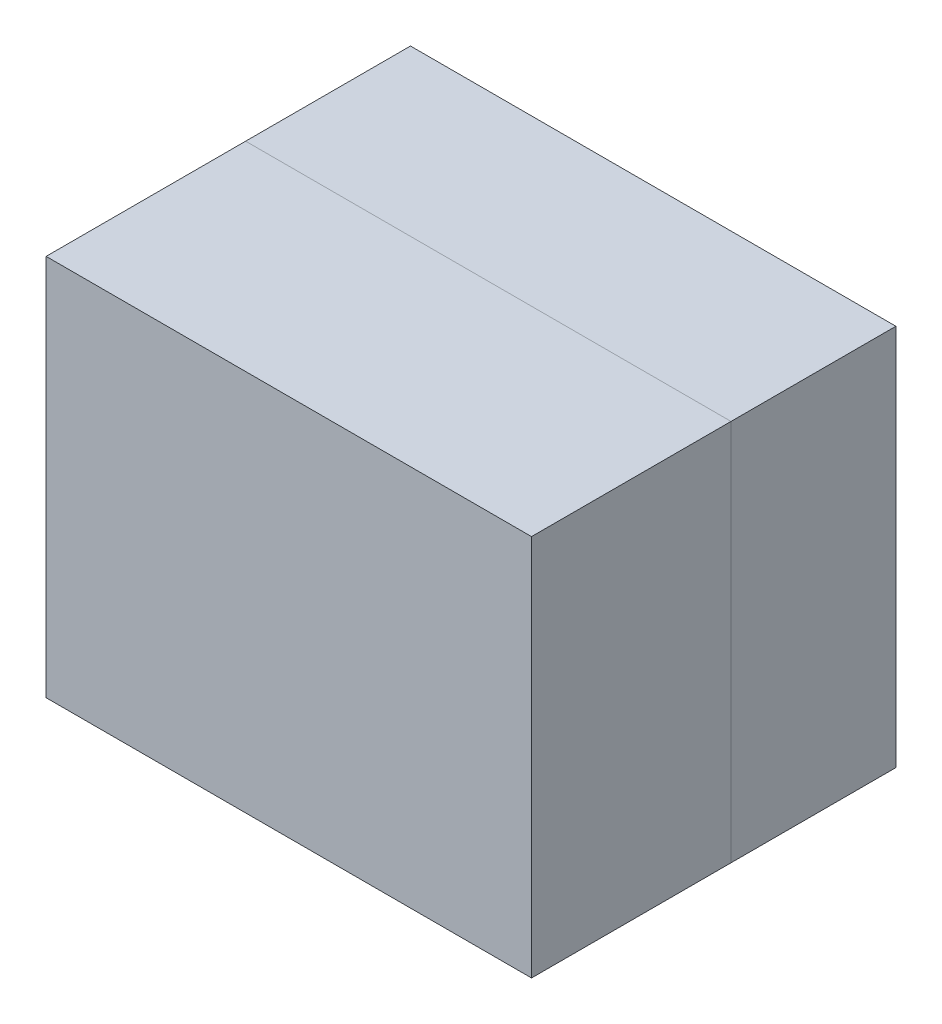
ISO-10303-21;
HEADER;
FILE_DESCRIPTION(('STEP AP214'),'2;1');
FILE_NAME('part.step','',(''),(''),'','','');
FILE_SCHEMA(('AUTOMOTIVE_DESIGN { 1 0 10303 214 1 1 1 1 }'));
ENDSEC;
DATA;
#1=APPLICATION_CONTEXT('core data for automotive mechanical design processes');
#2=APPLICATION_PROTOCOL_DEFINITION('international standard','automotive_design',2000,#1);
#3=PRODUCT_CONTEXT('',#1,'mechanical');
#4=PRODUCT('Part','Part','',(#3));
#5=PRODUCT_RELATED_PRODUCT_CATEGORY('part','',(#4));
#6=PRODUCT_DEFINITION_FORMATION('','',#4);
#7=PRODUCT_DEFINITION_CONTEXT('part definition',#1,'design');
#8=PRODUCT_DEFINITION('design','',#6,#7);
#9=PRODUCT_DEFINITION_SHAPE('','',#8);
#10=(LENGTH_UNIT() NAMED_UNIT(*) SI_UNIT(.MILLI.,.METRE.));
#11=(NAMED_UNIT(*) PLANE_ANGLE_UNIT() SI_UNIT($,.RADIAN.));
#12=(NAMED_UNIT(*) SI_UNIT($,.STERADIAN.) SOLID_ANGLE_UNIT());
#13=UNCERTAINTY_MEASURE_WITH_UNIT(LENGTH_MEASURE(1.E-05),#10,'distance_accuracy_value','');
#14=(GEOMETRIC_REPRESENTATION_CONTEXT(3) GLOBAL_UNCERTAINTY_ASSIGNED_CONTEXT((#13)) GLOBAL_UNIT_ASSIGNED_CONTEXT((#10,
#11,#12)) REPRESENTATION_CONTEXT('',''));
#15=CARTESIAN_POINT('',(0.,0.,0.));
#16=DIRECTION('',(0.,0.,1.));
#17=DIRECTION('',(1.,0.,0.));
#18=AXIS2_PLACEMENT_3D('',#15,#16,#17);
#19=CARTESIAN_POINT('',(-123.163130348937,-2.57676600394687,-14.0098849352523));
#20=DIRECTION('',(0.,0.,1.));
#21=DIRECTION('',(2.95009476501169E-07,0.999999999999956,0.));
#22=AXIS2_PLACEMENT_3D('',#19,#20,#21);
#23=PLANE('',#22);
#24=CARTESIAN_POINT('',(0.,0.,-14.0098849352523));
#25=DIRECTION('',(0.,0.,1.));
#26=DIRECTION('',(1.,0.,0.));
#27=AXIS2_PLACEMENT_3D('',#24,#25,#26);
#28=CIRCLE('',#27,123.163129588767);
#29=CARTESIAN_POINT('',(123.163129588767,0.,-14.0098849352523));
#30=VERTEX_POINT('',#29);
#31=EDGE_CURVE('E187',#30,#30,#28,.F.);
#32=ORIENTED_EDGE('',*,*,#31,.F.);
#33=EDGE_LOOP('',(#32));
#34=FACE_BOUND('',#33,.T.);
#35=DIRECTION('',(0.,-1.,0.));
#36=VECTOR('',#35,1.);
#37=CARTESIAN_POINT('',(-196.264396927718,-154.56749762986,-14.0098849352522));
#38=LINE('',#37,#36);
#39=CARTESIAN_POINT('',(-196.264396927718,154.56749762986,-14.0098849352525));
#40=VERTEX_POINT('',#39);
#41=CARTESIAN_POINT('',(-196.264396927718,-154.56749762986,-14.0098849352522));
#42=VERTEX_POINT('',#41);
#43=EDGE_CURVE('E14',#40,#42,#38,.T.);
#44=ORIENTED_EDGE('',*,*,#43,.F.);
#45=DIRECTION('',(-1.,0.,0.));
#46=VECTOR('',#45,1.);
#47=CARTESIAN_POINT('',(196.264396927718,154.56749762986,-14.0098849352525));
#48=LINE('',#47,#46);
#49=CARTESIAN_POINT('',(196.264396927718,154.56749762986,-14.0098849352525));
#50=VERTEX_POINT('',#49);
#51=EDGE_CURVE('E154',#50,#40,#48,.T.);
#52=ORIENTED_EDGE('',*,*,#51,.F.);
#53=DIRECTION('',(0.,1.,0.));
#54=VECTOR('',#53,1.);
#55=CARTESIAN_POINT('',(196.264396927718,-154.56749762986,-14.0098849352522));
#56=LINE('',#55,#54);
#57=CARTESIAN_POINT('',(196.264396927718,-154.56749762986,-14.0098849352522));
#58=VERTEX_POINT('',#57);
#59=EDGE_CURVE('E149',#58,#50,#56,.T.);
#60=ORIENTED_EDGE('',*,*,#59,.F.);
#61=DIRECTION('',(1.,0.,0.));
#62=VECTOR('',#61,1.);
#63=CARTESIAN_POINT('',(196.264396927718,-154.56749762986,-14.0098849352522));
#64=LINE('',#63,#62);
#65=EDGE_CURVE('E170',#42,#58,#64,.T.);
#66=ORIENTED_EDGE('',*,*,#65,.F.);
#67=EDGE_LOOP('',(#44,#52,#60,#66));
#68=FACE_BOUND('',#67,.T.);
#69=ADVANCED_FACE('F113',(#34,#68),#23,.F.);
#70=CARTESIAN_POINT('',(0.,0.,-28.0197698705047));
#71=DIRECTION('',(0.,0.,-1.));
#72=DIRECTION('',(-1.,0.,0.));
#73=AXIS2_PLACEMENT_3D('',#70,#71,#72);
#74=PLANE('',#73);
#75=CARTESIAN_POINT('',(38.0945416703802,33.8046158066014,-28.0197698705047));
#76=DIRECTION('',(0.,0.,-1.));
#77=DIRECTION('',(-1.,0.,0.));
#78=AXIS2_PLACEMENT_3D('',#75,#76,#77);
#79=CIRCLE('',#78,19.0624040936366);
#80=CARTESIAN_POINT('',(19.0321375767436,33.8046158066014,-28.0197698705047));
#81=VERTEX_POINT('',#80);
#82=EDGE_CURVE('E196',#81,#81,#79,.T.);
#83=ORIENTED_EDGE('',*,*,#82,.T.);
#84=EDGE_LOOP('',(#83));
#85=FACE_BOUND('',#84,.T.);
#86=ADVANCED_FACE('F237',(#85),#74,.T.);
#87=CARTESIAN_POINT('',(38.0945416703802,33.8046158066014,0.));
#88=DIRECTION('',(0.,0.,1.));
#89=DIRECTION('',(1.,0.,0.));
#90=AXIS2_PLACEMENT_3D('',#87,#88,#89);
#91=CONICAL_SURFACE('',#90,19.551490996,0.0174532925199433);
#92=CARTESIAN_POINT('',(38.0945416703802,33.8046158066014,0.));
#93=DIRECTION('',(0.,0.,1.));
#94=DIRECTION('',(1.,0.,0.));
#95=AXIS2_PLACEMENT_3D('',#92,#93,#94);
#96=CIRCLE('',#95,19.551490996);
#97=CARTESIAN_POINT('',(57.6460326663802,33.8046158066014,0.));
#98=VERTEX_POINT('',#97);
#99=EDGE_CURVE('E208',#98,#98,#96,.T.);
#100=ORIENTED_EDGE('',*,*,#99,.F.);
#101=EDGE_LOOP('',(#100));
#102=FACE_BOUND('',#101,.T.);
#103=ORIENTED_EDGE('',*,*,#82,.F.);
#104=EDGE_LOOP('',(#103));
#105=FACE_BOUND('',#104,.T.);
#106=ADVANCED_FACE('F242',(#102,#105),#91,.T.);
#107=CARTESIAN_POINT('',(-33.8046158066013,38.0945416703823,0.));
#108=DIRECTION('',(0.,0.,1.));
#109=DIRECTION('',(1.,0.,0.));
#110=AXIS2_PLACEMENT_3D('',#107,#108,#109);
#111=CONICAL_SURFACE('',#110,19.551490996,0.0174532925199433);
#112=CARTESIAN_POINT('',(-33.8046158066013,38.0945416703823,0.));
#113=DIRECTION('',(0.,0.,1.));
#114=DIRECTION('',(1.,0.,0.));
#115=AXIS2_PLACEMENT_3D('',#112,#113,#114);
#116=CIRCLE('',#115,19.551490996);
#117=CARTESIAN_POINT('',(-14.2531248106013,38.0945416703823,0.));
#118=VERTEX_POINT('',#117);
#119=EDGE_CURVE('E202',#118,#118,#116,.T.);
#120=ORIENTED_EDGE('',*,*,#119,.F.);
#121=EDGE_LOOP('',(#120));
#122=FACE_BOUND('',#121,.T.);
#123=CARTESIAN_POINT('',(-33.8046158066013,38.0945416703823,-28.0197698705047));
#124=DIRECTION('',(0.,0.,-1.));
#125=DIRECTION('',(-1.,0.,0.));
#126=AXIS2_PLACEMENT_3D('',#123,#124,#125);
#127=CIRCLE('',#126,19.0624040936366);
#128=CARTESIAN_POINT('',(-52.867019900238,38.0945416703823,-28.0197698705047));
#129=VERTEX_POINT('',#128);
#130=EDGE_CURVE('E186',#129,#129,#127,.T.);
#131=ORIENTED_EDGE('',*,*,#130,.F.);
#132=EDGE_LOOP('',(#131));
#133=FACE_BOUND('',#132,.T.);
#134=ADVANCED_FACE('F249',(#122,#133),#111,.T.);
#135=CARTESIAN_POINT('',(-38.0945416703822,-33.8046158065993,0.));
#136=DIRECTION('',(0.,0.,1.));
#137=DIRECTION('',(1.,0.,0.));
#138=AXIS2_PLACEMENT_3D('',#135,#136,#137);
#139=CONICAL_SURFACE('',#138,19.551490996,0.0174532925199433);
#140=CARTESIAN_POINT('',(-38.0945416703822,-33.8046158065993,0.));
#141=DIRECTION('',(0.,0.,1.));
#142=DIRECTION('',(1.,0.,0.));
#143=AXIS2_PLACEMENT_3D('',#140,#141,#142);
#144=CIRCLE('',#143,19.551490996);
#145=CARTESIAN_POINT('',(-18.5430506743822,-33.8046158065993,0.));
#146=VERTEX_POINT('',#145);
#147=EDGE_CURVE('E195',#146,#146,#144,.T.);
#148=ORIENTED_EDGE('',*,*,#147,.F.);
#149=EDGE_LOOP('',(#148));
#150=FACE_BOUND('',#149,.T.);
#151=CARTESIAN_POINT('',(-38.0945416703822,-33.8046158065993,-28.0197698705047));
#152=DIRECTION('',(0.,0.,-1.));
#153=DIRECTION('',(-1.,0.,0.));
#154=AXIS2_PLACEMENT_3D('',#151,#152,#153);
#155=CIRCLE('',#154,19.0624040936366);
#156=CARTESIAN_POINT('',(-57.1569457640188,-33.8046158065993,-28.0197698705047));
#157=VERTEX_POINT('',#156);
#158=EDGE_CURVE('E191',#157,#157,#155,.T.);
#159=ORIENTED_EDGE('',*,*,#158,.F.);
#160=EDGE_LOOP('',(#159));
#161=FACE_BOUND('',#160,.T.);
#162=ADVANCED_FACE('F253',(#150,#161),#139,.T.);
#163=CARTESIAN_POINT('',(33.8046158065994,-38.0945416703802,0.));
#164=DIRECTION('',(0.,0.,1.));
#165=DIRECTION('',(1.,0.,0.));
#166=AXIS2_PLACEMENT_3D('',#163,#164,#165);
#167=CONICAL_SURFACE('',#166,19.551490996,0.0174532925199433);
#168=CARTESIAN_POINT('',(33.8046158065994,-38.0945416703802,0.));
#169=DIRECTION('',(0.,0.,1.));
#170=DIRECTION('',(1.,0.,0.));
#171=AXIS2_PLACEMENT_3D('',#168,#169,#170);
#172=CIRCLE('',#171,19.551490996);
#173=CARTESIAN_POINT('',(53.3561068025994,-38.0945416703802,0.));
#174=VERTEX_POINT('',#173);
#175=EDGE_CURVE('E192',#174,#174,#172,.T.);
#176=ORIENTED_EDGE('',*,*,#175,.F.);
#177=EDGE_LOOP('',(#176));
#178=FACE_BOUND('',#177,.T.);
#179=CARTESIAN_POINT('',(33.8046158065994,-38.0945416703802,-28.0197698705047));
#180=DIRECTION('',(0.,0.,-1.));
#181=DIRECTION('',(-1.,0.,0.));
#182=AXIS2_PLACEMENT_3D('',#179,#180,#181);
#183=CIRCLE('',#182,19.0624040936366);
#184=CARTESIAN_POINT('',(14.7422117129628,-38.0945416703802,-28.0197698705047));
#185=VERTEX_POINT('',#184);
#186=EDGE_CURVE('E182',#185,#185,#183,.T.);
#187=ORIENTED_EDGE('',*,*,#186,.F.);
#188=EDGE_LOOP('',(#187));
#189=FACE_BOUND('',#188,.T.);
#190=ADVANCED_FACE('F257',(#178,#189),#167,.T.);
#191=CARTESIAN_POINT('',(0.,0.,0.));
#192=DIRECTION('',(0.,0.,1.));
#193=DIRECTION('',(1.,0.,0.));
#194=AXIS2_PLACEMENT_3D('',#191,#192,#193);
#195=PLANE('',#194);
#196=ORIENTED_EDGE('',*,*,#175,.T.);
#197=EDGE_LOOP('',(#196));
#198=FACE_BOUND('',#197,.T.);
#199=ORIENTED_EDGE('',*,*,#147,.T.);
#200=EDGE_LOOP('',(#199));
#201=FACE_BOUND('',#200,.T.);
#202=ORIENTED_EDGE('',*,*,#119,.T.);
#203=EDGE_LOOP('',(#202));
#204=FACE_BOUND('',#203,.T.);
#205=ORIENTED_EDGE('',*,*,#99,.T.);
#206=EDGE_LOOP('',(#205));
#207=FACE_BOUND('',#206,.T.);
#208=CARTESIAN_POINT('',(0.,0.,0.));
#209=DIRECTION('',(0.,0.,1.));
#210=DIRECTION('',(1.,0.,0.));
#211=AXIS2_PLACEMENT_3D('',#208,#209,#210);
#212=CIRCLE('',#211,89.3383966885656);
#213=CARTESIAN_POINT('',(89.3383966885656,0.,0.));
#214=VERTEX_POINT('',#213);
#215=EDGE_CURVE('E183',#214,#214,#212,.T.);
#216=ORIENTED_EDGE('',*,*,#215,.F.);
#217=EDGE_LOOP('',(#216));
#218=FACE_BOUND('',#217,.T.);
#219=ADVANCED_FACE('F261',(#198,#201,#204,#207,#218),#195,.F.);
#220=CARTESIAN_POINT('',(0.,0.,-14.0098849352523));
#221=DIRECTION('',(0.,0.,1.));
#222=DIRECTION('',(1.,0.,0.));
#223=AXIS2_PLACEMENT_3D('',#220,#221,#222);
#224=TOROIDAL_SURFACE('',#223,103.349382121437,19.8137474673303);
#225=ORIENTED_EDGE('',*,*,#31,.T.);
#226=EDGE_LOOP('',(#225));
#227=FACE_BOUND('',#226,.T.);
#228=ORIENTED_EDGE('',*,*,#215,.T.);
#229=EDGE_LOOP('',(#228));
#230=FACE_BOUND('',#229,.T.);
#231=ADVANCED_FACE('F265',(#227,#230),#224,.F.);
#232=CARTESIAN_POINT('',(0.,0.,-28.0197698705047));
#233=DIRECTION('',(0.,0.,1.));
#234=DIRECTION('',(1.,0.,0.));
#235=AXIS2_PLACEMENT_3D('',#232,#233,#234);
#236=PLANE('',#235);
#237=ORIENTED_EDGE('',*,*,#130,.T.);
#238=EDGE_LOOP('',(#237));
#239=FACE_BOUND('',#238,.T.);
#240=ADVANCED_FACE('F269',(#239),#236,.F.);
#241=CARTESIAN_POINT('',(0.,0.,-28.0197698705047));
#242=DIRECTION('',(0.,0.,1.));
#243=DIRECTION('',(1.,0.,0.));
#244=AXIS2_PLACEMENT_3D('',#241,#242,#243);
#245=PLANE('',#244);
#246=ORIENTED_EDGE('',*,*,#158,.T.);
#247=EDGE_LOOP('',(#246));
#248=FACE_BOUND('',#247,.T.);
#249=ADVANCED_FACE('F272',(#248),#245,.F.);
#250=CARTESIAN_POINT('',(0.,0.,-28.0197698705047));
#251=DIRECTION('',(0.,0.,1.));
#252=DIRECTION('',(1.,0.,0.));
#253=AXIS2_PLACEMENT_3D('',#250,#251,#252);
#254=PLANE('',#253);
#255=ORIENTED_EDGE('',*,*,#186,.T.);
#256=EDGE_LOOP('',(#255));
#257=FACE_BOUND('',#256,.T.);
#258=ADVANCED_FACE('F115',(#257),#254,.F.);
#259=CARTESIAN_POINT('',(0.,0.,147.32));
#260=DIRECTION('',(0.,0.,1.));
#261=DIRECTION('',(1.,0.,0.));
#262=AXIS2_PLACEMENT_3D('',#259,#260,#261);
#263=PLANE('',#262);
#264=DIRECTION('',(0.,-1.,0.));
#265=VECTOR('',#264,1.);
#266=CARTESIAN_POINT('',(-196.264396927718,-154.56749762986,147.32));
#267=LINE('',#266,#265);
#268=CARTESIAN_POINT('',(-196.264396927718,154.56749762986,147.32));
#269=VERTEX_POINT('',#268);
#270=CARTESIAN_POINT('',(-196.264396927718,-154.56749762986,147.32));
#271=VERTEX_POINT('',#270);
#272=EDGE_CURVE('E164',#269,#271,#267,.T.);
#273=ORIENTED_EDGE('',*,*,#272,.T.);
#274=DIRECTION('',(1.,0.,0.));
#275=VECTOR('',#274,1.);
#276=CARTESIAN_POINT('',(196.264396927718,-154.56749762986,147.32));
#277=LINE('',#276,#275);
#278=CARTESIAN_POINT('',(196.264396927718,-154.56749762986,147.32));
#279=VERTEX_POINT('',#278);
#280=EDGE_CURVE('E133',#271,#279,#277,.T.);
#281=ORIENTED_EDGE('',*,*,#280,.T.);
#282=DIRECTION('',(0.,1.,0.));
#283=VECTOR('',#282,1.);
#284=CARTESIAN_POINT('',(196.264396927718,-154.56749762986,147.32));
#285=LINE('',#284,#283);
#286=CARTESIAN_POINT('',(196.264396927718,154.56749762986,147.32));
#287=VERTEX_POINT('',#286);
#288=EDGE_CURVE('E160',#279,#287,#285,.T.);
#289=ORIENTED_EDGE('',*,*,#288,.T.);
#290=DIRECTION('',(-1.,0.,0.));
#291=VECTOR('',#290,1.);
#292=CARTESIAN_POINT('',(196.264396927718,154.56749762986,147.32));
#293=LINE('',#292,#291);
#294=EDGE_CURVE('E177',#287,#269,#293,.T.);
#295=ORIENTED_EDGE('',*,*,#294,.T.);
#296=EDGE_LOOP('',(#273,#281,#289,#295));
#297=FACE_BOUND('',#296,.T.);
#298=ADVANCED_FACE('F162',(#297),#263,.T.);
#299=CARTESIAN_POINT('',(196.264396927718,154.56749762986,147.32));
#300=DIRECTION('',(0.,-1.,0.));
#301=DIRECTION('',(0.,0.,-1.));
#302=AXIS2_PLACEMENT_3D('',#299,#300,#301);
#303=PLANE('',#302);
#304=DIRECTION('',(0.,0.,-1.));
#305=VECTOR('',#304,1.);
#306=CARTESIAN_POINT('',(196.264396927718,154.56749762986,147.32));
#307=LINE('',#306,#305);
#308=EDGE_CURVE('E175',#287,#50,#307,.T.);
#309=ORIENTED_EDGE('',*,*,#308,.T.);
#310=ORIENTED_EDGE('',*,*,#51,.T.);
#311=DIRECTION('',(0.,0.,-1.));
#312=VECTOR('',#311,1.);
#313=CARTESIAN_POINT('',(-196.264396927718,154.56749762986,147.32));
#314=LINE('',#313,#312);
#315=EDGE_CURVE('E124',#269,#40,#314,.T.);
#316=ORIENTED_EDGE('',*,*,#315,.F.);
#317=ORIENTED_EDGE('',*,*,#294,.F.);
#318=EDGE_LOOP('',(#309,#310,#316,#317));
#319=FACE_BOUND('',#318,.T.);
#320=ADVANCED_FACE('F226',(#319),#303,.F.);
#321=CARTESIAN_POINT('',(196.264396927718,-154.56749762986,147.32));
#322=DIRECTION('',(-1.,0.,0.));
#323=DIRECTION('',(0.,0.,1.));
#324=AXIS2_PLACEMENT_3D('',#321,#322,#323);
#325=PLANE('',#324);
#326=DIRECTION('',(0.,0.,-1.));
#327=VECTOR('',#326,1.);
#328=CARTESIAN_POINT('',(196.264396927718,-154.56749762986,147.32));
#329=LINE('',#328,#327);
#330=EDGE_CURVE('E168',#279,#58,#329,.T.);
#331=ORIENTED_EDGE('',*,*,#330,.T.);
#332=ORIENTED_EDGE('',*,*,#59,.T.);
#333=ORIENTED_EDGE('',*,*,#308,.F.);
#334=ORIENTED_EDGE('',*,*,#288,.F.);
#335=EDGE_LOOP('',(#331,#332,#333,#334));
#336=FACE_BOUND('',#335,.T.);
#337=ADVANCED_FACE('F173',(#336),#325,.F.);
#338=CARTESIAN_POINT('',(196.264396927718,-154.56749762986,147.32));
#339=DIRECTION('',(0.,1.,0.));
#340=DIRECTION('',(0.,0.,1.));
#341=AXIS2_PLACEMENT_3D('',#338,#339,#340);
#342=PLANE('',#341);
#343=DIRECTION('',(0.,0.,-1.));
#344=VECTOR('',#343,1.);
#345=CARTESIAN_POINT('',(-196.264396927718,-154.56749762986,147.32));
#346=LINE('',#345,#344);
#347=EDGE_CURVE('E219',#271,#42,#346,.T.);
#348=ORIENTED_EDGE('',*,*,#347,.T.);
#349=ORIENTED_EDGE('',*,*,#65,.T.);
#350=ORIENTED_EDGE('',*,*,#330,.F.);
#351=ORIENTED_EDGE('',*,*,#280,.F.);
#352=EDGE_LOOP('',(#348,#349,#350,#351));
#353=FACE_BOUND('',#352,.T.);
#354=ADVANCED_FACE('F169',(#353),#342,.F.);
#355=CARTESIAN_POINT('',(-196.264396927718,-154.56749762986,147.32));
#356=DIRECTION('',(1.,0.,0.));
#357=DIRECTION('',(0.,0.,-1.));
#358=AXIS2_PLACEMENT_3D('',#355,#356,#357);
#359=PLANE('',#358);
#360=ORIENTED_EDGE('',*,*,#315,.T.);
#361=ORIENTED_EDGE('',*,*,#43,.T.);
#362=ORIENTED_EDGE('',*,*,#347,.F.);
#363=ORIENTED_EDGE('',*,*,#272,.F.);
#364=EDGE_LOOP('',(#360,#361,#362,#363));
#365=FACE_BOUND('',#364,.T.);
#366=ADVANCED_FACE('F224',(#365),#359,.F.);
#367=CLOSED_SHELL('',(#69,#86,#106,#134,#162,#190,#219,#231,#240,#249,#258,#298,#320,#337,#354,#366));
#368=MANIFOLD_SOLID_BREP('B2',#367);
#369=CARTESIAN_POINT('',(0.,0.,-14.0098849352523));
#370=DIRECTION('',(0.,0.,1.));
#371=DIRECTION('',(1.,0.,0.));
#372=AXIS2_PLACEMENT_3D('',#369,#370,#371);
#373=TOROIDAL_SURFACE('',#372,103.349382121437,19.8137474673303);
#374=CARTESIAN_POINT('',(0.,0.,-28.0197698705047));
#375=DIRECTION('',(0.,0.,1.));
#376=DIRECTION('',(1.,0.,0.));
#377=AXIS2_PLACEMENT_3D('',#374,#375,#376);
#378=CIRCLE('',#377,89.3383966885656);
#379=CARTESIAN_POINT('',(89.3383966885656,0.,-28.0197698705047));
#380=VERTEX_POINT('',#379);
#381=EDGE_CURVE('E495',#380,#380,#378,.T.);
#382=ORIENTED_EDGE('',*,*,#381,.T.);
#383=EDGE_LOOP('',(#382));
#384=FACE_BOUND('',#383,.T.);
#385=CARTESIAN_POINT('',(0.,0.,-14.0098849352523));
#386=DIRECTION('',(0.,0.,-1.));
#387=DIRECTION('',(-1.,0.,0.));
#388=AXIS2_PLACEMENT_3D('',#385,#386,#387);
#389=CIRCLE('',#388,123.163129588767);
#390=CARTESIAN_POINT('',(-123.163129588767,0.,-14.0098849352523));
#391=VERTEX_POINT('',#390);
#392=EDGE_CURVE('E112',#391,#391,#389,.T.);
#393=ORIENTED_EDGE('',*,*,#392,.T.);
#394=EDGE_LOOP('',(#393));
#395=FACE_BOUND('',#394,.T.);
#396=ADVANCED_FACE('F488',(#384,#395),#373,.T.);
#397=CARTESIAN_POINT('',(0.,0.,-28.0197698705047));
#398=DIRECTION('',(0.,0.,-1.));
#399=DIRECTION('',(-1.,0.,0.));
#400=AXIS2_PLACEMENT_3D('',#397,#398,#399);
#401=PLANE('',#400);
#402=CARTESIAN_POINT('',(33.8046158065994,-38.0945416703802,-28.0197698705047));
#403=DIRECTION('',(0.,0.,-1.));
#404=DIRECTION('',(-1.,0.,0.));
#405=AXIS2_PLACEMENT_3D('',#402,#403,#404);
#406=CIRCLE('',#405,19.0624040936366);
#407=CARTESIAN_POINT('',(14.7422117129628,-38.0945416703802,-28.0197698705047));
#408=VERTEX_POINT('',#407);
#409=EDGE_CURVE('E525',#408,#408,#406,.T.);
#410=ORIENTED_EDGE('',*,*,#409,.F.);
#411=EDGE_LOOP('',(#410));
#412=FACE_BOUND('',#411,.T.);
#413=CARTESIAN_POINT('',(-38.0945416703822,-33.8046158065993,-28.0197698705047));
#414=DIRECTION('',(0.,0.,-1.));
#415=DIRECTION('',(-1.,0.,0.));
#416=AXIS2_PLACEMENT_3D('',#413,#414,#415);
#417=CIRCLE('',#416,19.0624040936366);
#418=CARTESIAN_POINT('',(-57.1569457640188,-33.8046158065993,-28.0197698705047));
#419=VERTEX_POINT('',#418);
#420=EDGE_CURVE('E522',#419,#419,#417,.T.);
#421=ORIENTED_EDGE('',*,*,#420,.F.);
#422=EDGE_LOOP('',(#421));
#423=FACE_BOUND('',#422,.T.);
#424=CARTESIAN_POINT('',(-33.8046158066013,38.0945416703823,-28.0197698705047));
#425=DIRECTION('',(0.,0.,-1.));
#426=DIRECTION('',(-1.,0.,0.));
#427=AXIS2_PLACEMENT_3D('',#424,#425,#426);
#428=CIRCLE('',#427,19.0624040936366);
#429=CARTESIAN_POINT('',(-52.867019900238,38.0945416703823,-28.0197698705047));
#430=VERTEX_POINT('',#429);
#431=EDGE_CURVE('E519',#430,#430,#428,.T.);
#432=ORIENTED_EDGE('',*,*,#431,.F.);
#433=EDGE_LOOP('',(#432));
#434=FACE_BOUND('',#433,.T.);
#435=CARTESIAN_POINT('',(38.0945416703802,33.8046158066014,-28.0197698705047));
#436=DIRECTION('',(0.,0.,-1.));
#437=DIRECTION('',(-1.,0.,0.));
#438=AXIS2_PLACEMENT_3D('',#435,#436,#437);
#439=CIRCLE('',#438,19.0624040936366);
#440=CARTESIAN_POINT('',(19.0321375767436,33.8046158066014,-28.0197698705047));
#441=VERTEX_POINT('',#440);
#442=EDGE_CURVE('E511',#441,#441,#439,.T.);
#443=ORIENTED_EDGE('',*,*,#442,.F.);
#444=EDGE_LOOP('',(#443));
#445=FACE_BOUND('',#444,.T.);
#446=ORIENTED_EDGE('',*,*,#381,.F.);
#447=EDGE_LOOP('',(#446));
#448=FACE_BOUND('',#447,.T.);
#449=ADVANCED_FACE('F532',(#412,#423,#434,#445,#448),#401,.T.);
#450=ORIENTED_EDGE('',*,*,#392,.F.);
#451=EDGE_LOOP('',(#450));
#452=FACE_BOUND('',#451,.T.);
#453=CARTESIAN_POINT('',(0.,0.,0.));
#454=DIRECTION('',(0.,0.,1.));
#455=DIRECTION('',(1.,0.,0.));
#456=AXIS2_PLACEMENT_3D('',#453,#454,#455);
#457=CIRCLE('',#456,89.3383966885656);
#458=CARTESIAN_POINT('',(89.3383966885656,0.,0.));
#459=VERTEX_POINT('',#458);
#460=EDGE_CURVE('E499',#459,#459,#457,.T.);
#461=ORIENTED_EDGE('',*,*,#460,.F.);
#462=EDGE_LOOP('',(#461));
#463=FACE_BOUND('',#462,.T.);
#464=ADVANCED_FACE('F535',(#452,#463),#373,.T.);
#465=CARTESIAN_POINT('',(0.,0.,0.));
#466=DIRECTION('',(0.,0.,1.));
#467=DIRECTION('',(1.,0.,0.));
#468=AXIS2_PLACEMENT_3D('',#465,#466,#467);
#469=PLANE('',#468);
#470=CARTESIAN_POINT('',(33.8046158065994,-38.0945416703802,0.));
#471=DIRECTION('',(0.,0.,1.));
#472=DIRECTION('',(1.,0.,0.));
#473=AXIS2_PLACEMENT_3D('',#470,#471,#472);
#474=CIRCLE('',#473,19.551490996);
#475=CARTESIAN_POINT('',(53.3561068025994,-38.0945416703802,0.));
#476=VERTEX_POINT('',#475);
#477=EDGE_CURVE('E504',#476,#476,#474,.T.);
#478=ORIENTED_EDGE('',*,*,#477,.F.);
#479=EDGE_LOOP('',(#478));
#480=FACE_BOUND('',#479,.T.);
#481=CARTESIAN_POINT('',(-38.0945416703822,-33.8046158065993,0.));
#482=DIRECTION('',(0.,0.,1.));
#483=DIRECTION('',(1.,0.,0.));
#484=AXIS2_PLACEMENT_3D('',#481,#482,#483);
#485=CIRCLE('',#484,19.551490996);
#486=CARTESIAN_POINT('',(-18.5430506743822,-33.8046158065993,0.));
#487=VERTEX_POINT('',#486);
#488=EDGE_CURVE('E514',#487,#487,#485,.T.);
#489=ORIENTED_EDGE('',*,*,#488,.F.);
#490=EDGE_LOOP('',(#489));
#491=FACE_BOUND('',#490,.T.);
#492=CARTESIAN_POINT('',(-33.8046158066013,38.0945416703823,0.));
#493=DIRECTION('',(0.,0.,1.));
#494=DIRECTION('',(1.,0.,0.));
#495=AXIS2_PLACEMENT_3D('',#492,#493,#494);
#496=CIRCLE('',#495,19.551490996);
#497=CARTESIAN_POINT('',(-14.2531248106013,38.0945416703823,0.));
#498=VERTEX_POINT('',#497);
#499=EDGE_CURVE('E510',#498,#498,#496,.T.);
#500=ORIENTED_EDGE('',*,*,#499,.F.);
#501=EDGE_LOOP('',(#500));
#502=FACE_BOUND('',#501,.T.);
#503=CARTESIAN_POINT('',(38.0945416703802,33.8046158066014,0.));
#504=DIRECTION('',(0.,0.,1.));
#505=DIRECTION('',(1.,0.,0.));
#506=AXIS2_PLACEMENT_3D('',#503,#504,#505);
#507=CIRCLE('',#506,19.551490996);
#508=CARTESIAN_POINT('',(57.6460326663802,33.8046158066014,0.));
#509=VERTEX_POINT('',#508);
#510=EDGE_CURVE('E507',#509,#509,#507,.T.);
#511=ORIENTED_EDGE('',*,*,#510,.F.);
#512=EDGE_LOOP('',(#511));
#513=FACE_BOUND('',#512,.T.);
#514=ORIENTED_EDGE('',*,*,#460,.T.);
#515=EDGE_LOOP('',(#514));
#516=FACE_BOUND('',#515,.T.);
#517=ADVANCED_FACE('F545',(#480,#491,#502,#513,#516),#469,.T.);
#518=CARTESIAN_POINT('',(38.0945416703802,33.8046158066014,0.));
#519=DIRECTION('',(0.,0.,1.));
#520=DIRECTION('',(1.,0.,0.));
#521=AXIS2_PLACEMENT_3D('',#518,#519,#520);
#522=CONICAL_SURFACE('',#521,19.551490996,0.0174532925199433);
#523=ORIENTED_EDGE('',*,*,#510,.T.);
#524=EDGE_LOOP('',(#523));
#525=FACE_BOUND('',#524,.T.);
#526=ORIENTED_EDGE('',*,*,#442,.T.);
#527=EDGE_LOOP('',(#526));
#528=FACE_BOUND('',#527,.T.);
#529=ADVANCED_FACE('F490',(#525,#528),#522,.F.);
#530=CARTESIAN_POINT('',(-33.8046158066013,38.0945416703823,0.));
#531=DIRECTION('',(0.,0.,1.));
#532=DIRECTION('',(1.,0.,0.));
#533=AXIS2_PLACEMENT_3D('',#530,#531,#532);
#534=CONICAL_SURFACE('',#533,19.551490996,0.0174532925199433);
#535=ORIENTED_EDGE('',*,*,#499,.T.);
#536=EDGE_LOOP('',(#535));
#537=FACE_BOUND('',#536,.T.);
#538=ORIENTED_EDGE('',*,*,#431,.T.);
#539=EDGE_LOOP('',(#538));
#540=FACE_BOUND('',#539,.T.);
#541=ADVANCED_FACE('F544',(#537,#540),#534,.F.);
#542=CARTESIAN_POINT('',(-38.0945416703822,-33.8046158065993,0.));
#543=DIRECTION('',(0.,0.,1.));
#544=DIRECTION('',(1.,0.,0.));
#545=AXIS2_PLACEMENT_3D('',#542,#543,#544);
#546=CONICAL_SURFACE('',#545,19.551490996,0.0174532925199433);
#547=ORIENTED_EDGE('',*,*,#488,.T.);
#548=EDGE_LOOP('',(#547));
#549=FACE_BOUND('',#548,.T.);
#550=ORIENTED_EDGE('',*,*,#420,.T.);
#551=EDGE_LOOP('',(#550));
#552=FACE_BOUND('',#551,.T.);
#553=ADVANCED_FACE('F530',(#549,#552),#546,.F.);
#554=CARTESIAN_POINT('',(33.8046158065994,-38.0945416703802,0.));
#555=DIRECTION('',(0.,0.,1.));
#556=DIRECTION('',(1.,0.,0.));
#557=AXIS2_PLACEMENT_3D('',#554,#555,#556);
#558=CONICAL_SURFACE('',#557,19.551490996,0.0174532925199433);
#559=ORIENTED_EDGE('',*,*,#477,.T.);
#560=EDGE_LOOP('',(#559));
#561=FACE_BOUND('',#560,.T.);
#562=ORIENTED_EDGE('',*,*,#409,.T.);
#563=EDGE_LOOP('',(#562));
#564=FACE_BOUND('',#563,.T.);
#565=ADVANCED_FACE('F582',(#561,#564),#558,.F.);
#566=CLOSED_SHELL('',(#396,#449,#464,#517,#529,#541,#553,#565));
#567=MANIFOLD_SOLID_BREP('B8',#566);
#568=CARTESIAN_POINT('',(-196.264396927718,-154.56749762986,147.32));
#569=DIRECTION('',(1.,0.,0.));
#570=DIRECTION('',(0.,0.,-1.));
#571=AXIS2_PLACEMENT_3D('',#568,#569,#570);
#572=PLANE('',#571);
#573=DIRECTION('',(0.,-1.,0.));
#574=VECTOR('',#573,1.);
#575=CARTESIAN_POINT('',(-196.264396927718,-154.56749762986,-14.0098849352522));
#576=LINE('',#575,#574);
#577=CARTESIAN_POINT('',(-196.264396927718,154.56749762986,-14.0098849352525));
#578=VERTEX_POINT('',#577);
#579=CARTESIAN_POINT('',(-196.264396927718,-154.56749762986,-14.0098849352522));
#580=VERTEX_POINT('',#579);
#581=EDGE_CURVE('E680',#578,#580,#576,.T.);
#582=ORIENTED_EDGE('',*,*,#581,.F.);
#583=DIRECTION('',(0.,0.,-1.));
#584=VECTOR('',#583,1.);
#585=CARTESIAN_POINT('',(-196.264396927718,154.56749762986,147.32));
#586=LINE('',#585,#584);
#587=CARTESIAN_POINT('',(-196.264396927718,154.56749762986,-147.32));
#588=VERTEX_POINT('',#587);
#589=EDGE_CURVE('E720',#578,#588,#586,.T.);
#590=ORIENTED_EDGE('',*,*,#589,.T.);
#591=DIRECTION('',(0.,-1.,0.));
#592=VECTOR('',#591,1.);
#593=CARTESIAN_POINT('',(-196.264396927718,-154.56749762986,-147.32));
#594=LINE('',#593,#592);
#595=CARTESIAN_POINT('',(-196.264396927718,-154.56749762986,-147.32));
#596=VERTEX_POINT('',#595);
#597=EDGE_CURVE('E715',#588,#596,#594,.T.);
#598=ORIENTED_EDGE('',*,*,#597,.T.);
#599=DIRECTION('',(0.,0.,-1.));
#600=VECTOR('',#599,1.);
#601=CARTESIAN_POINT('',(-196.264396927718,-154.56749762986,147.32));
#602=LINE('',#601,#600);
#603=EDGE_CURVE('E700',#580,#596,#602,.T.);
#604=ORIENTED_EDGE('',*,*,#603,.F.);
#605=EDGE_LOOP('',(#582,#590,#598,#604));
#606=FACE_BOUND('',#605,.T.);
#607=ADVANCED_FACE('F662',(#606),#572,.F.);
#608=CARTESIAN_POINT('',(196.264396927718,-154.56749762986,147.32));
#609=DIRECTION('',(0.,1.,0.));
#610=DIRECTION('',(0.,0.,1.));
#611=AXIS2_PLACEMENT_3D('',#608,#609,#610);
#612=PLANE('',#611);
#613=DIRECTION('',(1.,0.,0.));
#614=VECTOR('',#613,1.);
#615=CARTESIAN_POINT('',(196.264396927718,-154.56749762986,-14.0098849352522));
#616=LINE('',#615,#614);
#617=CARTESIAN_POINT('',(196.264396927718,-154.56749762986,-14.0098849352522));
#618=VERTEX_POINT('',#617);
#619=EDGE_CURVE('E706',#580,#618,#616,.T.);
#620=ORIENTED_EDGE('',*,*,#619,.F.);
#621=ORIENTED_EDGE('',*,*,#603,.T.);
#622=DIRECTION('',(1.,0.,0.));
#623=VECTOR('',#622,1.);
#624=CARTESIAN_POINT('',(196.264396927718,-154.56749762986,-147.32));
#625=LINE('',#624,#623);
#626=CARTESIAN_POINT('',(196.264396927718,-154.56749762986,-147.32));
#627=VERTEX_POINT('',#626);
#628=EDGE_CURVE('E704',#596,#627,#625,.T.);
#629=ORIENTED_EDGE('',*,*,#628,.T.);
#630=DIRECTION('',(0.,0.,-1.));
#631=VECTOR('',#630,1.);
#632=CARTESIAN_POINT('',(196.264396927718,-154.56749762986,147.32));
#633=LINE('',#632,#631);
#634=EDGE_CURVE('E710',#618,#627,#633,.T.);
#635=ORIENTED_EDGE('',*,*,#634,.F.);
#636=EDGE_LOOP('',(#620,#621,#629,#635));
#637=FACE_BOUND('',#636,.T.);
#638=ADVANCED_FACE('F702',(#637),#612,.F.);
#639=CARTESIAN_POINT('',(196.264396927718,-154.56749762986,147.32));
#640=DIRECTION('',(-1.,0.,0.));
#641=DIRECTION('',(0.,0.,1.));
#642=AXIS2_PLACEMENT_3D('',#639,#640,#641);
#643=PLANE('',#642);
#644=DIRECTION('',(0.,1.,0.));
#645=VECTOR('',#644,1.);
#646=CARTESIAN_POINT('',(196.264396927718,-154.56749762986,-14.0098849352522));
#647=LINE('',#646,#645);
#648=CARTESIAN_POINT('',(196.264396927718,154.56749762986,-14.0098849352525));
#649=VERTEX_POINT('',#648);
#650=EDGE_CURVE('E709',#618,#649,#647,.T.);
#651=ORIENTED_EDGE('',*,*,#650,.F.);
#652=ORIENTED_EDGE('',*,*,#634,.T.);
#653=DIRECTION('',(0.,1.,0.));
#654=VECTOR('',#653,1.);
#655=CARTESIAN_POINT('',(196.264396927718,-154.56749762986,-147.32));
#656=LINE('',#655,#654);
#657=CARTESIAN_POINT('',(196.264396927718,154.56749762986,-147.32));
#658=VERTEX_POINT('',#657);
#659=EDGE_CURVE('E717',#627,#658,#656,.T.);
#660=ORIENTED_EDGE('',*,*,#659,.T.);
#661=DIRECTION('',(0.,0.,-1.));
#662=VECTOR('',#661,1.);
#663=CARTESIAN_POINT('',(196.264396927718,154.56749762986,147.32));
#664=LINE('',#663,#662);
#665=EDGE_CURVE('E730',#649,#658,#664,.T.);
#666=ORIENTED_EDGE('',*,*,#665,.F.);
#667=EDGE_LOOP('',(#651,#652,#660,#666));
#668=FACE_BOUND('',#667,.T.);
#669=ADVANCED_FACE('F734',(#668),#643,.F.);
#670=CARTESIAN_POINT('',(196.264396927718,154.56749762986,147.32));
#671=DIRECTION('',(0.,-1.,0.));
#672=DIRECTION('',(0.,0.,-1.));
#673=AXIS2_PLACEMENT_3D('',#670,#671,#672);
#674=PLANE('',#673);
#675=DIRECTION('',(-1.,0.,0.));
#676=VECTOR('',#675,1.);
#677=CARTESIAN_POINT('',(196.264396927718,154.56749762986,-14.0098849352525));
#678=LINE('',#677,#676);
#679=EDGE_CURVE('E665',#649,#578,#678,.T.);
#680=ORIENTED_EDGE('',*,*,#679,.F.);
#681=ORIENTED_EDGE('',*,*,#665,.T.);
#682=DIRECTION('',(-1.,0.,0.));
#683=VECTOR('',#682,1.);
#684=CARTESIAN_POINT('',(196.264396927718,154.56749762986,-147.32));
#685=LINE('',#684,#683);
#686=EDGE_CURVE('E727',#658,#588,#685,.T.);
#687=ORIENTED_EDGE('',*,*,#686,.T.);
#688=ORIENTED_EDGE('',*,*,#589,.F.);
#689=EDGE_LOOP('',(#680,#681,#687,#688));
#690=FACE_BOUND('',#689,.T.);
#691=ADVANCED_FACE('F750',(#690),#674,.F.);
#692=CARTESIAN_POINT('',(0.,0.,-147.32));
#693=DIRECTION('',(0.,0.,1.));
#694=DIRECTION('',(1.,0.,0.));
#695=AXIS2_PLACEMENT_3D('',#692,#693,#694);
#696=PLANE('',#695);
#697=ORIENTED_EDGE('',*,*,#597,.F.);
#698=ORIENTED_EDGE('',*,*,#686,.F.);
#699=ORIENTED_EDGE('',*,*,#659,.F.);
#700=ORIENTED_EDGE('',*,*,#628,.F.);
#701=EDGE_LOOP('',(#697,#698,#699,#700));
#702=FACE_BOUND('',#701,.T.);
#703=ADVANCED_FACE('F713',(#702),#696,.F.);
#704=CARTESIAN_POINT('',(-123.163130348937,-2.57676600394687,-14.0098849352523));
#705=DIRECTION('',(0.,0.,1.));
#706=DIRECTION('',(2.95009476501169E-07,0.999999999999956,0.));
#707=AXIS2_PLACEMENT_3D('',#704,#705,#706);
#708=PLANE('',#707);
#709=CARTESIAN_POINT('',(0.,0.,-14.0098849352523));
#710=DIRECTION('',(0.,0.,1.));
#711=DIRECTION('',(1.,0.,0.));
#712=AXIS2_PLACEMENT_3D('',#709,#710,#711);
#713=CIRCLE('',#712,123.163129588767);
#714=CARTESIAN_POINT('',(123.163129588767,0.,-14.0098849352523));
#715=VERTEX_POINT('',#714);
#716=EDGE_CURVE('E671',#715,#715,#713,.F.);
#717=ORIENTED_EDGE('',*,*,#716,.T.);
#718=EDGE_LOOP('',(#717));
#719=FACE_BOUND('',#718,.T.);
#720=ORIENTED_EDGE('',*,*,#581,.T.);
#721=ORIENTED_EDGE('',*,*,#619,.T.);
#722=ORIENTED_EDGE('',*,*,#650,.T.);
#723=ORIENTED_EDGE('',*,*,#679,.T.);
#724=EDGE_LOOP('',(#720,#721,#722,#723));
#725=FACE_BOUND('',#724,.T.);
#726=ADVANCED_FACE('F748',(#719,#725),#708,.T.);
#727=CARTESIAN_POINT('',(0.,0.,-28.0197698705047));
#728=DIRECTION('',(0.,0.,-1.));
#729=DIRECTION('',(-1.,0.,0.));
#730=AXIS2_PLACEMENT_3D('',#727,#728,#729);
#731=PLANE('',#730);
#732=CARTESIAN_POINT('',(0.,0.,-28.0197698705047));
#733=DIRECTION('',(0.,0.,1.));
#734=DIRECTION('',(1.,0.,0.));
#735=AXIS2_PLACEMENT_3D('',#732,#733,#734);
#736=CIRCLE('',#735,89.3383966885656);
#737=CARTESIAN_POINT('',(89.3383966885656,0.,-28.0197698705047));
#738=VERTEX_POINT('',#737);
#739=EDGE_CURVE('E486',#738,#738,#736,.T.);
#740=ORIENTED_EDGE('',*,*,#739,.T.);
#741=EDGE_LOOP('',(#740));
#742=FACE_BOUND('',#741,.T.);
#743=ADVANCED_FACE('F789',(#742),#731,.F.);
#744=CARTESIAN_POINT('',(0.,0.,-14.0098849352523));
#745=DIRECTION('',(0.,0.,1.));
#746=DIRECTION('',(1.,0.,0.));
#747=AXIS2_PLACEMENT_3D('',#744,#745,#746);
#748=TOROIDAL_SURFACE('',#747,103.349382121437,19.8137474673303);
#749=ORIENTED_EDGE('',*,*,#739,.F.);
#750=EDGE_LOOP('',(#749));
#751=FACE_BOUND('',#750,.T.);
#752=ORIENTED_EDGE('',*,*,#716,.F.);
#753=EDGE_LOOP('',(#752));
#754=FACE_BOUND('',#753,.T.);
#755=ADVANCED_FACE('F797',(#751,#754),#748,.F.);
#756=CLOSED_SHELL('',(#607,#638,#669,#691,#703,#726,#743,#755));
#757=MANIFOLD_SOLID_BREP('B107',#756);
#758=ADVANCED_BREP_SHAPE_REPRESENTATION('',(#18,#368,#567,#757),#14);
#759=SHAPE_DEFINITION_REPRESENTATION(#9,#758);
ENDSEC;
END-ISO-10303-21;
